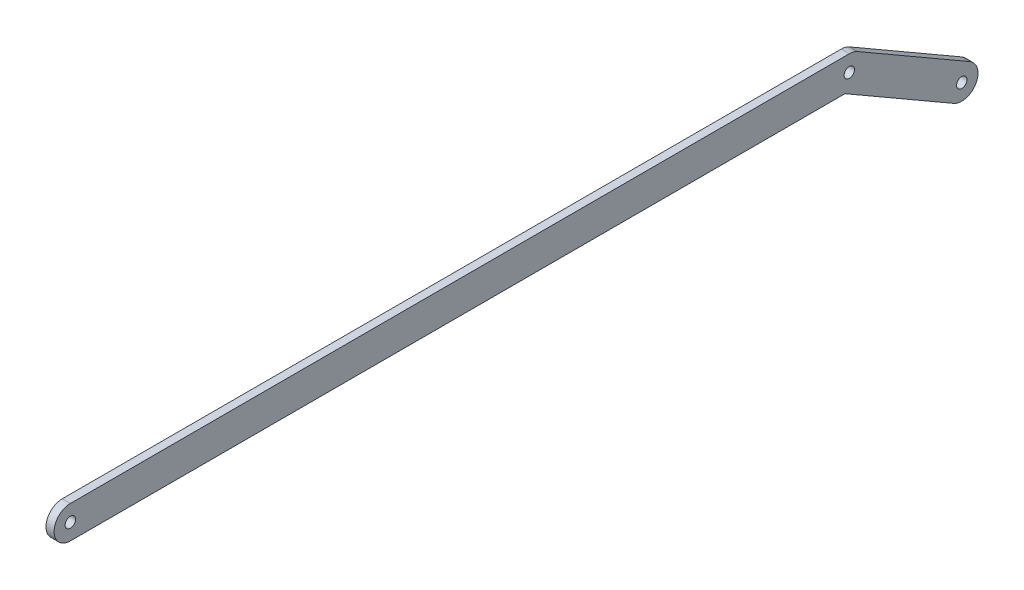
ISO-10303-21;
HEADER;
FILE_DESCRIPTION(('STEP AP214'),'2;1');
FILE_NAME('part.step','',(''),(''),'','','');
FILE_SCHEMA(('AUTOMOTIVE_DESIGN { 1 0 10303 214 1 1 1 1 }'));
ENDSEC;
DATA;
#1=APPLICATION_CONTEXT('core data for automotive mechanical design processes');
#2=APPLICATION_PROTOCOL_DEFINITION('international standard','automotive_design',2000,#1);
#3=PRODUCT_CONTEXT('',#1,'mechanical');
#4=PRODUCT('Part','Part','',(#3));
#5=PRODUCT_RELATED_PRODUCT_CATEGORY('part','',(#4));
#6=PRODUCT_DEFINITION_FORMATION('','',#4);
#7=PRODUCT_DEFINITION_CONTEXT('part definition',#1,'design');
#8=PRODUCT_DEFINITION('design','',#6,#7);
#9=PRODUCT_DEFINITION_SHAPE('','',#8);
#10=(LENGTH_UNIT() NAMED_UNIT(*) SI_UNIT(.MILLI.,.METRE.));
#11=(NAMED_UNIT(*) PLANE_ANGLE_UNIT() SI_UNIT($,.RADIAN.));
#12=(NAMED_UNIT(*) SI_UNIT($,.STERADIAN.) SOLID_ANGLE_UNIT());
#13=UNCERTAINTY_MEASURE_WITH_UNIT(LENGTH_MEASURE(1.E-05),#10,'distance_accuracy_value','');
#14=(GEOMETRIC_REPRESENTATION_CONTEXT(3) GLOBAL_UNCERTAINTY_ASSIGNED_CONTEXT((#13)) GLOBAL_UNIT_ASSIGNED_CONTEXT((#10,
#11,#12)) REPRESENTATION_CONTEXT('',''));
#15=CARTESIAN_POINT('',(0.,0.,0.));
#16=DIRECTION('',(0.,0.,1.));
#17=DIRECTION('',(1.,0.,0.));
#18=AXIS2_PLACEMENT_3D('',#15,#16,#17);
#19=CARTESIAN_POINT('',(3.175,5.4992613140312,-3.17499999999996));
#20=DIRECTION('',(0.,0.866025403784442,-0.499999999999995));
#21=DIRECTION('',(0.,0.499999999999995,0.866025403784442));
#22=AXIS2_PLACEMENT_3D('',#19,#20,#21);
#23=PLANE('',#22);
#24=DIRECTION('',(0.,-0.499999999999995,-0.866025403784442));
#25=VECTOR('',#24,1.);
#26=CARTESIAN_POINT('',(0.,5.4992613140312,-3.17499999999996));
#27=LINE('',#26,#25);
#28=CARTESIAN_POINT('',(0.,5.4992613140312,-3.17499999999996));
#29=VERTEX_POINT('',#28);
#30=CARTESIAN_POINT('',(0.,-19.9007386859685,-47.1690905122496));
#31=VERTEX_POINT('',#30);
#32=EDGE_CURVE('E169',#29,#31,#27,.T.);
#33=ORIENTED_EDGE('',*,*,#32,.F.);
#34=DIRECTION('',(-1.,0.,0.));
#35=VECTOR('',#34,1.);
#36=CARTESIAN_POINT('',(3.175,5.4992613140312,-3.17499999999996));
#37=LINE('',#36,#35);
#38=CARTESIAN_POINT('',(3.175,5.4992613140312,-3.17499999999996));
#39=VERTEX_POINT('',#38);
#40=EDGE_CURVE('E11',#39,#29,#37,.T.);
#41=ORIENTED_EDGE('',*,*,#40,.F.);
#42=DIRECTION('',(0.,-0.499999999999995,-0.866025403784442));
#43=VECTOR('',#42,1.);
#44=CARTESIAN_POINT('',(3.175,5.4992613140312,-3.17499999999996));
#45=LINE('',#44,#43);
#46=CARTESIAN_POINT('',(3.175,-19.9007386859685,-47.1690905122496));
#47=VERTEX_POINT('',#46);
#48=EDGE_CURVE('E201',#39,#47,#45,.T.);
#49=ORIENTED_EDGE('',*,*,#48,.T.);
#50=DIRECTION('',(-1.,0.,0.));
#51=VECTOR('',#50,1.);
#52=CARTESIAN_POINT('',(3.175,-19.9007386859685,-47.1690905122496));
#53=LINE('',#52,#51);
#54=EDGE_CURVE('E106',#47,#31,#53,.T.);
#55=ORIENTED_EDGE('',*,*,#54,.T.);
#56=EDGE_LOOP('',(#33,#41,#49,#55));
#57=FACE_BOUND('',#56,.T.);
#58=ADVANCED_FACE('F47',(#57),#23,.T.);
#59=CARTESIAN_POINT('',(3.175,0.,0.));
#60=DIRECTION('',(-1.,0.,0.));
#61=DIRECTION('',(0.,0.,1.));
#62=AXIS2_PLACEMENT_3D('',#59,#60,#61);
#63=CYLINDRICAL_SURFACE('',#62,6.35);
#64=CARTESIAN_POINT('',(0.,0.,0.));
#65=DIRECTION('',(1.,0.,0.));
#66=DIRECTION('',(0.,0.,-1.));
#67=AXIS2_PLACEMENT_3D('',#64,#65,#66);
#68=CIRCLE('',#67,6.35);
#69=CARTESIAN_POINT('',(0.,6.35,0.));
#70=VERTEX_POINT('',#69);
#71=EDGE_CURVE('E173',#29,#70,#68,.T.);
#72=ORIENTED_EDGE('',*,*,#71,.T.);
#73=DIRECTION('',(-1.,0.,0.));
#74=VECTOR('',#73,1.);
#75=CARTESIAN_POINT('',(3.175,6.35,0.));
#76=LINE('',#75,#74);
#77=CARTESIAN_POINT('',(3.175,6.35,0.));
#78=VERTEX_POINT('',#77);
#79=EDGE_CURVE('E56',#78,#70,#76,.T.);
#80=ORIENTED_EDGE('',*,*,#79,.F.);
#81=CARTESIAN_POINT('',(3.175,0.,0.));
#82=DIRECTION('',(1.,0.,0.));
#83=DIRECTION('',(0.,0.,-1.));
#84=AXIS2_PLACEMENT_3D('',#81,#82,#83);
#85=CIRCLE('',#84,6.35);
#86=EDGE_CURVE('E244',#39,#78,#85,.T.);
#87=ORIENTED_EDGE('',*,*,#86,.F.);
#88=ORIENTED_EDGE('',*,*,#40,.T.);
#89=EDGE_LOOP('',(#72,#80,#87,#88));
#90=FACE_BOUND('',#89,.T.);
#91=ADVANCED_FACE('F234',(#90),#63,.T.);
#92=CARTESIAN_POINT('',(3.175,6.35,0.));
#93=DIRECTION('',(0.,-1.,0.));
#94=DIRECTION('',(0.,0.,-1.));
#95=AXIS2_PLACEMENT_3D('',#92,#93,#94);
#96=PLANE('',#95);
#97=DIRECTION('',(0.,0.,1.));
#98=VECTOR('',#97,1.);
#99=CARTESIAN_POINT('',(0.,6.35,0.));
#100=LINE('',#99,#98);
#101=CARTESIAN_POINT('',(0.,6.34999999999996,304.8));
#102=VERTEX_POINT('',#101);
#103=EDGE_CURVE('E176',#70,#102,#100,.T.);
#104=ORIENTED_EDGE('',*,*,#103,.T.);
#105=DIRECTION('',(-1.,0.,0.));
#106=VECTOR('',#105,1.);
#107=CARTESIAN_POINT('',(3.175,6.34999999999996,304.8));
#108=LINE('',#107,#106);
#109=CARTESIAN_POINT('',(3.175,6.34999999999996,304.8));
#110=VERTEX_POINT('',#109);
#111=EDGE_CURVE('E208',#110,#102,#108,.T.);
#112=ORIENTED_EDGE('',*,*,#111,.F.);
#113=DIRECTION('',(0.,0.,1.));
#114=VECTOR('',#113,1.);
#115=CARTESIAN_POINT('',(3.175,6.35,0.));
#116=LINE('',#115,#114);
#117=EDGE_CURVE('E151',#78,#110,#116,.T.);
#118=ORIENTED_EDGE('',*,*,#117,.F.);
#119=ORIENTED_EDGE('',*,*,#79,.T.);
#120=EDGE_LOOP('',(#104,#112,#118,#119));
#121=FACE_BOUND('',#120,.T.);
#122=ADVANCED_FACE('F217',(#121),#96,.F.);
#123=CARTESIAN_POINT('',(3.175,0.,304.8));
#124=DIRECTION('',(-1.,0.,0.));
#125=DIRECTION('',(0.,0.,1.));
#126=AXIS2_PLACEMENT_3D('',#123,#124,#125);
#127=CYLINDRICAL_SURFACE('',#126,6.35);
#128=CARTESIAN_POINT('',(0.,0.,304.8));
#129=DIRECTION('',(1.,0.,0.));
#130=DIRECTION('',(0.,0.,-1.));
#131=AXIS2_PLACEMENT_3D('',#128,#129,#130);
#132=CIRCLE('',#131,6.35);
#133=CARTESIAN_POINT('',(0.,-6.35000000000003,304.8));
#134=VERTEX_POINT('',#133);
#135=EDGE_CURVE('E179',#102,#134,#132,.T.);
#136=ORIENTED_EDGE('',*,*,#135,.T.);
#137=DIRECTION('',(-1.,0.,0.));
#138=VECTOR('',#137,1.);
#139=CARTESIAN_POINT('',(3.175,-6.35000000000003,304.8));
#140=LINE('',#139,#138);
#141=CARTESIAN_POINT('',(3.175,-6.35000000000003,304.8));
#142=VERTEX_POINT('',#141);
#143=EDGE_CURVE('E135',#142,#134,#140,.T.);
#144=ORIENTED_EDGE('',*,*,#143,.F.);
#145=CARTESIAN_POINT('',(3.175,0.,304.8));
#146=DIRECTION('',(1.,0.,0.));
#147=DIRECTION('',(0.,0.,-1.));
#148=AXIS2_PLACEMENT_3D('',#145,#146,#147);
#149=CIRCLE('',#148,6.35);
#150=EDGE_CURVE('E145',#110,#142,#149,.T.);
#151=ORIENTED_EDGE('',*,*,#150,.F.);
#152=ORIENTED_EDGE('',*,*,#111,.T.);
#153=EDGE_LOOP('',(#136,#144,#151,#152));
#154=FACE_BOUND('',#153,.T.);
#155=ADVANCED_FACE('F226',(#154),#127,.T.);
#156=CARTESIAN_POINT('',(3.175,-6.35,0.));
#157=DIRECTION('',(0.,-1.,0.));
#158=DIRECTION('',(0.,0.,-1.));
#159=AXIS2_PLACEMENT_3D('',#156,#157,#158);
#160=PLANE('',#159);
#161=DIRECTION('',(0.,0.,1.));
#162=VECTOR('',#161,1.);
#163=CARTESIAN_POINT('',(0.,-6.35,0.));
#164=LINE('',#163,#162);
#165=CARTESIAN_POINT('',(0.,-6.35,1.7014773719376));
#166=VERTEX_POINT('',#165);
#167=EDGE_CURVE('E133',#166,#134,#164,.T.);
#168=ORIENTED_EDGE('',*,*,#167,.F.);
#169=DIRECTION('',(-1.,0.,0.));
#170=VECTOR('',#169,1.);
#171=CARTESIAN_POINT('',(3.175,-6.35,1.7014773719376));
#172=LINE('',#171,#170);
#173=CARTESIAN_POINT('',(3.175,-6.35,1.7014773719376));
#174=VERTEX_POINT('',#173);
#175=EDGE_CURVE('E127',#174,#166,#172,.T.);
#176=ORIENTED_EDGE('',*,*,#175,.F.);
#177=DIRECTION('',(0.,0.,1.));
#178=VECTOR('',#177,1.);
#179=CARTESIAN_POINT('',(3.175,-6.35,0.));
#180=LINE('',#179,#178);
#181=EDGE_CURVE('E131',#174,#142,#180,.T.);
#182=ORIENTED_EDGE('',*,*,#181,.T.);
#183=ORIENTED_EDGE('',*,*,#143,.T.);
#184=EDGE_LOOP('',(#168,#176,#182,#183));
#185=FACE_BOUND('',#184,.T.);
#186=ADVANCED_FACE('F129',(#185),#160,.T.);
#187=CARTESIAN_POINT('',(3.175,-5.4992613140312,3.17499999999996));
#188=DIRECTION('',(0.,0.866025403784442,-0.499999999999995));
#189=DIRECTION('',(0.,0.499999999999995,0.866025403784442));
#190=AXIS2_PLACEMENT_3D('',#187,#188,#189);
#191=PLANE('',#190);
#192=DIRECTION('',(0.,-0.499999999999995,-0.866025403784442));
#193=VECTOR('',#192,1.);
#194=CARTESIAN_POINT('',(0.,-5.4992613140312,3.17499999999996));
#195=LINE('',#194,#193);
#196=CARTESIAN_POINT('',(0.,-30.8992613140309,-40.8190905122497));
#197=VERTEX_POINT('',#196);
#198=EDGE_CURVE('E98',#166,#197,#195,.T.);
#199=ORIENTED_EDGE('',*,*,#198,.T.);
#200=DIRECTION('',(-1.,0.,0.));
#201=VECTOR('',#200,1.);
#202=CARTESIAN_POINT('',(3.175,-30.8992613140309,-40.8190905122497));
#203=LINE('',#202,#201);
#204=CARTESIAN_POINT('',(3.175,-30.8992613140309,-40.8190905122497));
#205=VERTEX_POINT('',#204);
#206=EDGE_CURVE('E136',#205,#197,#203,.T.);
#207=ORIENTED_EDGE('',*,*,#206,.F.);
#208=DIRECTION('',(0.,-0.499999999999995,-0.866025403784442));
#209=VECTOR('',#208,1.);
#210=CARTESIAN_POINT('',(3.175,-5.4992613140312,3.17499999999996));
#211=LINE('',#210,#209);
#212=EDGE_CURVE('E138',#174,#205,#211,.T.);
#213=ORIENTED_EDGE('',*,*,#212,.F.);
#214=ORIENTED_EDGE('',*,*,#175,.T.);
#215=EDGE_LOOP('',(#199,#207,#213,#214));
#216=FACE_BOUND('',#215,.T.);
#217=ADVANCED_FACE('F139',(#216),#191,.F.);
#218=CARTESIAN_POINT('',(3.175,0.,0.));
#219=DIRECTION('',(-1.,0.,0.));
#220=DIRECTION('',(0.,0.,1.));
#221=AXIS2_PLACEMENT_3D('',#218,#219,#220);
#222=CYLINDRICAL_SURFACE('',#221,2.032);
#223=CARTESIAN_POINT('',(3.175,0.,0.));
#224=DIRECTION('',(1.,0.,0.));
#225=DIRECTION('',(0.,0.,-1.));
#226=AXIS2_PLACEMENT_3D('',#223,#224,#225);
#227=CIRCLE('',#226,2.032);
#228=CARTESIAN_POINT('',(3.175,0.,-2.032));
#229=VERTEX_POINT('',#228);
#230=EDGE_CURVE('E161',#229,#229,#227,.T.);
#231=ORIENTED_EDGE('',*,*,#230,.T.);
#232=EDGE_LOOP('',(#231));
#233=FACE_BOUND('',#232,.T.);
#234=CARTESIAN_POINT('',(0.,0.,0.));
#235=DIRECTION('',(1.,0.,0.));
#236=DIRECTION('',(0.,0.,-1.));
#237=AXIS2_PLACEMENT_3D('',#234,#235,#236);
#238=CIRCLE('',#237,2.032);
#239=CARTESIAN_POINT('',(0.,0.,-2.032));
#240=VERTEX_POINT('',#239);
#241=EDGE_CURVE('E193',#240,#240,#238,.T.);
#242=ORIENTED_EDGE('',*,*,#241,.F.);
#243=EDGE_LOOP('',(#242));
#244=FACE_BOUND('',#243,.T.);
#245=ADVANCED_FACE('F259',(#233,#244),#222,.F.);
#246=CARTESIAN_POINT('',(3.175,-25.3999999999997,-43.9940905122496));
#247=DIRECTION('',(-1.,0.,0.));
#248=DIRECTION('',(0.,0.,1.));
#249=AXIS2_PLACEMENT_3D('',#246,#247,#248);
#250=CYLINDRICAL_SURFACE('',#249,2.032);
#251=CARTESIAN_POINT('',(3.175,-25.3999999999997,-43.9940905122496));
#252=DIRECTION('',(1.,0.,0.));
#253=DIRECTION('',(0.,0.,-1.));
#254=AXIS2_PLACEMENT_3D('',#251,#252,#253);
#255=CIRCLE('',#254,2.032);
#256=CARTESIAN_POINT('',(3.175,-25.3999999999997,-46.0260905122496));
#257=VERTEX_POINT('',#256);
#258=EDGE_CURVE('E157',#257,#257,#255,.T.);
#259=ORIENTED_EDGE('',*,*,#258,.T.);
#260=EDGE_LOOP('',(#259));
#261=FACE_BOUND('',#260,.T.);
#262=CARTESIAN_POINT('',(0.,-25.3999999999997,-43.9940905122496));
#263=DIRECTION('',(1.,0.,0.));
#264=DIRECTION('',(0.,0.,-1.));
#265=AXIS2_PLACEMENT_3D('',#262,#263,#264);
#266=CIRCLE('',#265,2.032);
#267=CARTESIAN_POINT('',(0.,-25.3999999999997,-46.0260905122496));
#268=VERTEX_POINT('',#267);
#269=EDGE_CURVE('E189',#268,#268,#266,.T.);
#270=ORIENTED_EDGE('',*,*,#269,.F.);
#271=EDGE_LOOP('',(#270));
#272=FACE_BOUND('',#271,.T.);
#273=ADVANCED_FACE('F251',(#261,#272),#250,.F.);
#274=CARTESIAN_POINT('',(3.175,-25.3999999999997,-43.9940905122496));
#275=DIRECTION('',(-1.,0.,0.));
#276=DIRECTION('',(0.,0.,1.));
#277=AXIS2_PLACEMENT_3D('',#274,#275,#276);
#278=CYLINDRICAL_SURFACE('',#277,6.34999999999999);
#279=CARTESIAN_POINT('',(0.,-25.3999999999997,-43.9940905122496));
#280=DIRECTION('',(1.,0.,0.));
#281=DIRECTION('',(0.,0.,-1.));
#282=AXIS2_PLACEMENT_3D('',#279,#280,#281);
#283=CIRCLE('',#282,6.34999999999999);
#284=EDGE_CURVE('E186',#197,#31,#283,.T.);
#285=ORIENTED_EDGE('',*,*,#284,.T.);
#286=ORIENTED_EDGE('',*,*,#54,.F.);
#287=CARTESIAN_POINT('',(3.175,-25.3999999999997,-43.9940905122496));
#288=DIRECTION('',(1.,0.,0.));
#289=DIRECTION('',(0.,0.,-1.));
#290=AXIS2_PLACEMENT_3D('',#287,#288,#289);
#291=CIRCLE('',#290,6.34999999999999);
#292=EDGE_CURVE('E67',#205,#47,#291,.T.);
#293=ORIENTED_EDGE('',*,*,#292,.F.);
#294=ORIENTED_EDGE('',*,*,#206,.T.);
#295=EDGE_LOOP('',(#285,#286,#293,#294));
#296=FACE_BOUND('',#295,.T.);
#297=ADVANCED_FACE('F242',(#296),#278,.T.);
#298=CARTESIAN_POINT('',(3.175,0.,304.8));
#299=DIRECTION('',(-1.,0.,0.));
#300=DIRECTION('',(0.,0.,1.));
#301=AXIS2_PLACEMENT_3D('',#298,#299,#300);
#302=CYLINDRICAL_SURFACE('',#301,2.03199999999995);
#303=CARTESIAN_POINT('',(3.175,0.,304.8));
#304=DIRECTION('',(1.,0.,0.));
#305=DIRECTION('',(0.,0.,-1.));
#306=AXIS2_PLACEMENT_3D('',#303,#304,#305);
#307=CIRCLE('',#306,2.03199999999995);
#308=CARTESIAN_POINT('',(3.175,0.,302.768));
#309=VERTEX_POINT('',#308);
#310=EDGE_CURVE('E165',#309,#309,#307,.T.);
#311=ORIENTED_EDGE('',*,*,#310,.T.);
#312=EDGE_LOOP('',(#311));
#313=FACE_BOUND('',#312,.T.);
#314=CARTESIAN_POINT('',(0.,0.,304.8));
#315=DIRECTION('',(1.,0.,0.));
#316=DIRECTION('',(0.,0.,-1.));
#317=AXIS2_PLACEMENT_3D('',#314,#315,#316);
#318=CIRCLE('',#317,2.03199999999995);
#319=CARTESIAN_POINT('',(0.,0.,302.768));
#320=VERTEX_POINT('',#319);
#321=EDGE_CURVE('E197',#320,#320,#318,.T.);
#322=ORIENTED_EDGE('',*,*,#321,.F.);
#323=EDGE_LOOP('',(#322));
#324=FACE_BOUND('',#323,.T.);
#325=ADVANCED_FACE('F250',(#313,#324),#302,.F.);
#326=CARTESIAN_POINT('',(3.175,0.,0.));
#327=DIRECTION('',(1.,0.,0.));
#328=DIRECTION('',(0.,0.,-1.));
#329=AXIS2_PLACEMENT_3D('',#326,#327,#328);
#330=PLANE('',#329);
#331=ORIENTED_EDGE('',*,*,#48,.F.);
#332=ORIENTED_EDGE('',*,*,#86,.T.);
#333=ORIENTED_EDGE('',*,*,#117,.T.);
#334=ORIENTED_EDGE('',*,*,#150,.T.);
#335=ORIENTED_EDGE('',*,*,#181,.F.);
#336=ORIENTED_EDGE('',*,*,#212,.T.);
#337=ORIENTED_EDGE('',*,*,#292,.T.);
#338=EDGE_LOOP('',(#331,#332,#333,#334,#335,#336,#337));
#339=FACE_BOUND('',#338,.T.);
#340=ORIENTED_EDGE('',*,*,#258,.F.);
#341=EDGE_LOOP('',(#340));
#342=FACE_BOUND('',#341,.T.);
#343=ORIENTED_EDGE('',*,*,#230,.F.);
#344=EDGE_LOOP('',(#343));
#345=FACE_BOUND('',#344,.T.);
#346=ORIENTED_EDGE('',*,*,#310,.F.);
#347=EDGE_LOOP('',(#346));
#348=FACE_BOUND('',#347,.T.);
#349=ADVANCED_FACE('F142',(#339,#342,#345,#348),#330,.T.);
#350=CARTESIAN_POINT('',(0.,0.,0.));
#351=DIRECTION('',(1.,0.,0.));
#352=DIRECTION('',(0.,0.,-1.));
#353=AXIS2_PLACEMENT_3D('',#350,#351,#352);
#354=PLANE('',#353);
#355=ORIENTED_EDGE('',*,*,#32,.T.);
#356=ORIENTED_EDGE('',*,*,#284,.F.);
#357=ORIENTED_EDGE('',*,*,#198,.F.);
#358=ORIENTED_EDGE('',*,*,#167,.T.);
#359=ORIENTED_EDGE('',*,*,#135,.F.);
#360=ORIENTED_EDGE('',*,*,#103,.F.);
#361=ORIENTED_EDGE('',*,*,#71,.F.);
#362=EDGE_LOOP('',(#355,#356,#357,#358,#359,#360,#361));
#363=FACE_BOUND('',#362,.T.);
#364=ORIENTED_EDGE('',*,*,#269,.T.);
#365=EDGE_LOOP('',(#364));
#366=FACE_BOUND('',#365,.T.);
#367=ORIENTED_EDGE('',*,*,#241,.T.);
#368=EDGE_LOOP('',(#367));
#369=FACE_BOUND('',#368,.T.);
#370=ORIENTED_EDGE('',*,*,#321,.T.);
#371=EDGE_LOOP('',(#370));
#372=FACE_BOUND('',#371,.T.);
#373=ADVANCED_FACE('F223',(#363,#366,#369,#372),#354,.F.);
#374=CLOSED_SHELL('',(#58,#91,#122,#155,#186,#217,#245,#273,#297,#325,#349,#373));
#375=MANIFOLD_SOLID_BREP('B2',#374);
#376=ADVANCED_BREP_SHAPE_REPRESENTATION('',(#18,#375),#14);
#377=SHAPE_DEFINITION_REPRESENTATION(#9,#376);
ENDSEC;
END-ISO-10303-21;
